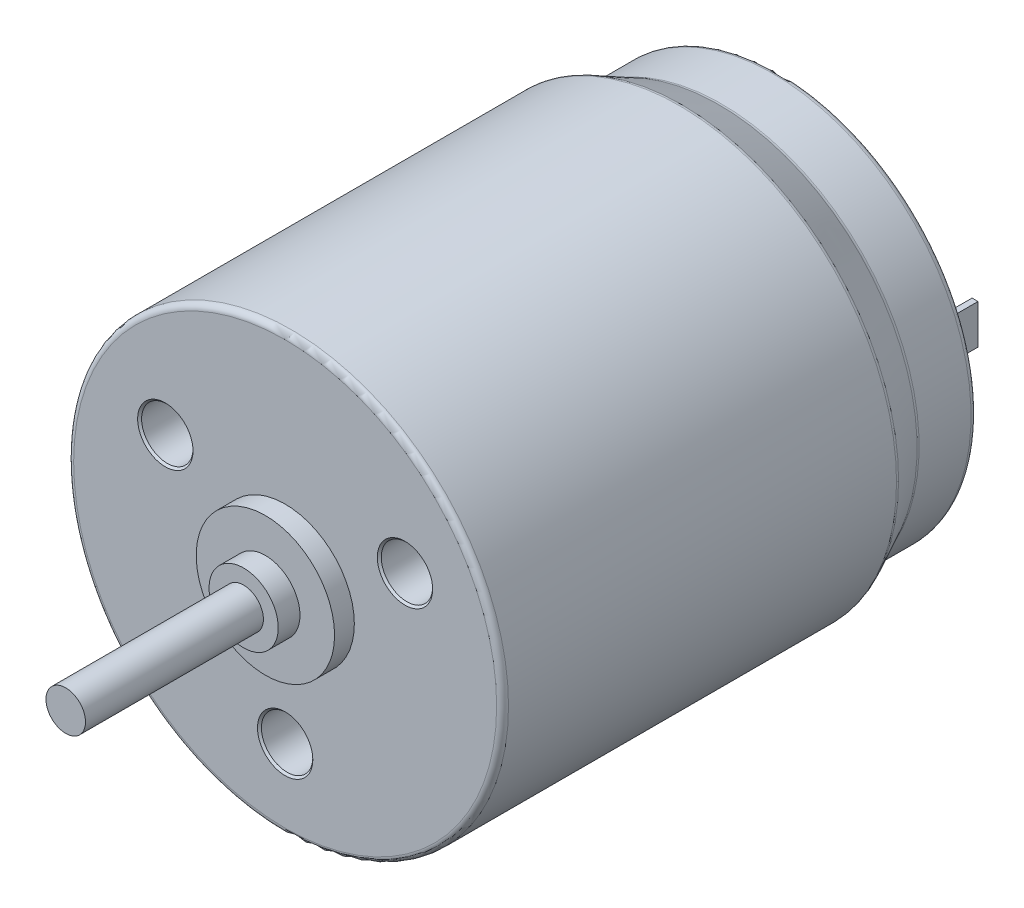
ISO-10303-21;
HEADER;
FILE_DESCRIPTION(('STEP AP214'),'2;1');
FILE_NAME('part.step','',(''),(''),'','','');
FILE_SCHEMA(('AUTOMOTIVE_DESIGN { 1 0 10303 214 1 1 1 1 }'));
ENDSEC;
DATA;
#1=APPLICATION_CONTEXT('core data for automotive mechanical design processes');
#2=APPLICATION_PROTOCOL_DEFINITION('international standard','automotive_design',2000,#1);
#3=PRODUCT_CONTEXT('',#1,'mechanical');
#4=PRODUCT('Part','Part','',(#3));
#5=PRODUCT_RELATED_PRODUCT_CATEGORY('part','',(#4));
#6=PRODUCT_DEFINITION_FORMATION('','',#4);
#7=PRODUCT_DEFINITION_CONTEXT('part definition',#1,'design');
#8=PRODUCT_DEFINITION('design','',#6,#7);
#9=PRODUCT_DEFINITION_SHAPE('','',#8);
#10=(LENGTH_UNIT() NAMED_UNIT(*) SI_UNIT(.MILLI.,.METRE.));
#11=(NAMED_UNIT(*) PLANE_ANGLE_UNIT() SI_UNIT($,.RADIAN.));
#12=(NAMED_UNIT(*) SI_UNIT($,.STERADIAN.) SOLID_ANGLE_UNIT());
#13=UNCERTAINTY_MEASURE_WITH_UNIT(LENGTH_MEASURE(1.E-05),#10,'distance_accuracy_value','');
#14=(GEOMETRIC_REPRESENTATION_CONTEXT(3) GLOBAL_UNCERTAINTY_ASSIGNED_CONTEXT((#13)) GLOBAL_UNIT_ASSIGNED_CONTEXT((#10,
#11,#12)) REPRESENTATION_CONTEXT('',''));
#15=CARTESIAN_POINT('',(0.,0.,0.));
#16=DIRECTION('',(0.,0.,1.));
#17=DIRECTION('',(1.,0.,0.));
#18=AXIS2_PLACEMENT_3D('',#15,#16,#17);
#19=CARTESIAN_POINT('',(0.,0.,-25.));
#20=DIRECTION('',(0.,0.,-1.));
#21=DIRECTION('',(-1.,0.,0.));
#22=AXIS2_PLACEMENT_3D('',#19,#20,#21);
#23=PLANE('',#22);
#24=CARTESIAN_POINT('',(0.,0.,-25.));
#25=DIRECTION('',(0.,0.,-1.));
#26=DIRECTION('',(-1.,0.,0.));
#27=AXIS2_PLACEMENT_3D('',#24,#25,#26);
#28=CIRCLE('',#27,9.7);
#29=CARTESIAN_POINT('',(-9.7,0.,-25.));
#30=VERTEX_POINT('',#29);
#31=EDGE_CURVE('E168',#30,#30,#28,.T.);
#32=ORIENTED_EDGE('',*,*,#31,.T.);
#33=EDGE_LOOP('',(#32));
#34=FACE_BOUND('',#33,.T.);
#35=DIRECTION('',(1.,0.,0.));
#36=VECTOR('',#35,1.);
#37=CARTESIAN_POINT('',(6.15,1.,-25.));
#38=LINE('',#37,#36);
#39=CARTESIAN_POINT('',(5.85,1.,-25.));
#40=VERTEX_POINT('',#39);
#41=CARTESIAN_POINT('',(6.15,1.,-25.));
#42=VERTEX_POINT('',#41);
#43=EDGE_CURVE('E133',#40,#42,#38,.T.);
#44=ORIENTED_EDGE('',*,*,#43,.F.);
#45=DIRECTION('',(0.,1.,0.));
#46=VECTOR('',#45,1.);
#47=CARTESIAN_POINT('',(5.85,1.,-25.));
#48=LINE('',#47,#46);
#49=CARTESIAN_POINT('',(5.85,-1.,-25.));
#50=VERTEX_POINT('',#49);
#51=EDGE_CURVE('E130',#50,#40,#48,.T.);
#52=ORIENTED_EDGE('',*,*,#51,.F.);
#53=DIRECTION('',(-1.,0.,0.));
#54=VECTOR('',#53,1.);
#55=CARTESIAN_POINT('',(6.15,-1.,-25.));
#56=LINE('',#55,#54);
#57=CARTESIAN_POINT('',(6.15,-1.,-25.));
#58=VERTEX_POINT('',#57);
#59=EDGE_CURVE('E142',#58,#50,#56,.T.);
#60=ORIENTED_EDGE('',*,*,#59,.F.);
#61=DIRECTION('',(0.,-1.,0.));
#62=VECTOR('',#61,1.);
#63=CARTESIAN_POINT('',(6.15,1.,-25.));
#64=LINE('',#63,#62);
#65=EDGE_CURVE('E150',#42,#58,#64,.T.);
#66=ORIENTED_EDGE('',*,*,#65,.F.);
#67=EDGE_LOOP('',(#44,#52,#60,#66));
#68=FACE_BOUND('',#67,.T.);
#69=DIRECTION('',(1.,0.,0.));
#70=VECTOR('',#69,1.);
#71=CARTESIAN_POINT('',(-5.85,1.,-25.));
#72=LINE('',#71,#70);
#73=CARTESIAN_POINT('',(-6.15,1.,-25.));
#74=VERTEX_POINT('',#73);
#75=CARTESIAN_POINT('',(-5.85,1.,-25.));
#76=VERTEX_POINT('',#75);
#77=EDGE_CURVE('E596',#74,#76,#72,.T.);
#78=ORIENTED_EDGE('',*,*,#77,.F.);
#79=DIRECTION('',(0.,1.,0.));
#80=VECTOR('',#79,1.);
#81=CARTESIAN_POINT('',(-6.15,1.,-25.));
#82=LINE('',#81,#80);
#83=CARTESIAN_POINT('',(-6.15,-1.,-25.));
#84=VERTEX_POINT('',#83);
#85=EDGE_CURVE('E128',#84,#74,#82,.T.);
#86=ORIENTED_EDGE('',*,*,#85,.F.);
#87=DIRECTION('',(-1.,0.,0.));
#88=VECTOR('',#87,1.);
#89=CARTESIAN_POINT('',(-5.85,-1.,-25.));
#90=LINE('',#89,#88);
#91=CARTESIAN_POINT('',(-5.85,-1.,-25.));
#92=VERTEX_POINT('',#91);
#93=EDGE_CURVE('E124',#92,#84,#90,.T.);
#94=ORIENTED_EDGE('',*,*,#93,.F.);
#95=DIRECTION('',(0.,-1.,0.));
#96=VECTOR('',#95,1.);
#97=CARTESIAN_POINT('',(-5.85,1.,-25.));
#98=LINE('',#97,#96);
#99=EDGE_CURVE('E593',#76,#92,#98,.T.);
#100=ORIENTED_EDGE('',*,*,#99,.F.);
#101=EDGE_LOOP('',(#78,#86,#94,#100));
#102=FACE_BOUND('',#101,.T.);
#103=ADVANCED_FACE('F39',(#34,#68,#102),#23,.T.);
#104=CARTESIAN_POINT('',(0.,0.,-20.));
#105=DIRECTION('',(0.,0.,1.));
#106=DIRECTION('',(1.,0.,0.));
#107=AXIS2_PLACEMENT_3D('',#104,#105,#106);
#108=CYLINDRICAL_SURFACE('',#107,11.);
#109=CARTESIAN_POINT('',(0.,0.,-19.9291796067501));
#110=DIRECTION('',(0.,0.,1.));
#111=DIRECTION('',(1.,0.,0.));
#112=AXIS2_PLACEMENT_3D('',#109,#110,#111);
#113=CIRCLE('',#112,11.);
#114=CARTESIAN_POINT('',(11.,0.,-19.9291796067501));
#115=VERTEX_POINT('',#114);
#116=EDGE_CURVE('E47',#115,#115,#113,.T.);
#117=ORIENTED_EDGE('',*,*,#116,.T.);
#118=EDGE_LOOP('',(#117));
#119=FACE_BOUND('',#118,.T.);
#120=CARTESIAN_POINT('',(0.,0.,-0.300000000000002));
#121=DIRECTION('',(0.,0.,1.));
#122=DIRECTION('',(1.,0.,0.));
#123=AXIS2_PLACEMENT_3D('',#120,#121,#122);
#124=CIRCLE('',#123,11.);
#125=CARTESIAN_POINT('',(11.,0.,-0.300000000000002));
#126=VERTEX_POINT('',#125);
#127=EDGE_CURVE('E221',#126,#126,#124,.F.);
#128=ORIENTED_EDGE('',*,*,#127,.T.);
#129=EDGE_LOOP('',(#128));
#130=FACE_BOUND('',#129,.T.);
#131=ADVANCED_FACE('F226',(#119,#130),#108,.T.);
#132=CARTESIAN_POINT('',(0.,0.,0.));
#133=DIRECTION('',(0.,0.,1.));
#134=DIRECTION('',(1.,0.,0.));
#135=AXIS2_PLACEMENT_3D('',#132,#133,#134);
#136=PLANE('',#135);
#137=CARTESIAN_POINT('',(0.,0.,0.));
#138=DIRECTION('',(0.,0.,1.));
#139=DIRECTION('',(1.,0.,0.));
#140=AXIS2_PLACEMENT_3D('',#137,#138,#139);
#141=CIRCLE('',#140,10.7);
#142=CARTESIAN_POINT('',(10.7,0.,0.));
#143=VERTEX_POINT('',#142);
#144=EDGE_CURVE('E12',#143,#143,#141,.T.);
#145=ORIENTED_EDGE('',*,*,#144,.T.);
#146=EDGE_LOOP('',(#145));
#147=FACE_BOUND('',#146,.T.);
#148=CARTESIAN_POINT('',(0.,0.,0.));
#149=DIRECTION('',(0.,0.,1.));
#150=DIRECTION('',(1.,0.,0.));
#151=AXIS2_PLACEMENT_3D('',#148,#149,#150);
#152=CIRCLE('',#151,3.5);
#153=CARTESIAN_POINT('',(3.5,0.,0.));
#154=VERTEX_POINT('',#153);
#155=EDGE_CURVE('E172',#154,#154,#152,.T.);
#156=ORIENTED_EDGE('',*,*,#155,.F.);
#157=EDGE_LOOP('',(#156));
#158=FACE_BOUND('',#157,.T.);
#159=CARTESIAN_POINT('',(0.,-7.,0.));
#160=DIRECTION('',(0.,0.,1.));
#161=DIRECTION('',(1.,0.,0.));
#162=AXIS2_PLACEMENT_3D('',#159,#160,#161);
#163=CIRCLE('',#162,1.4);
#164=CARTESIAN_POINT('',(1.4,-7.,0.));
#165=VERTEX_POINT('',#164);
#166=EDGE_CURVE('E199',#165,#165,#163,.F.);
#167=ORIENTED_EDGE('',*,*,#166,.T.);
#168=EDGE_LOOP('',(#167));
#169=FACE_BOUND('',#168,.T.);
#170=CARTESIAN_POINT('',(6.06217782649108,3.49999999999998,0.));
#171=DIRECTION('',(0.,0.,1.));
#172=DIRECTION('',(1.,0.,0.));
#173=AXIS2_PLACEMENT_3D('',#170,#171,#172);
#174=CIRCLE('',#173,1.40000000000001);
#175=CARTESIAN_POINT('',(7.46217782649109,3.49999999999998,0.));
#176=VERTEX_POINT('',#175);
#177=EDGE_CURVE('E196',#176,#176,#174,.F.);
#178=ORIENTED_EDGE('',*,*,#177,.T.);
#179=EDGE_LOOP('',(#178));
#180=FACE_BOUND('',#179,.T.);
#181=CARTESIAN_POINT('',(-6.06217782649108,3.49999999999998,0.));
#182=DIRECTION('',(0.,0.,1.));
#183=DIRECTION('',(1.,0.,0.));
#184=AXIS2_PLACEMENT_3D('',#181,#182,#183);
#185=CIRCLE('',#184,1.40000000000001);
#186=CARTESIAN_POINT('',(-4.66217782649108,3.49999999999998,0.));
#187=VERTEX_POINT('',#186);
#188=EDGE_CURVE('E193',#187,#187,#185,.F.);
#189=ORIENTED_EDGE('',*,*,#188,.T.);
#190=EDGE_LOOP('',(#189));
#191=FACE_BOUND('',#190,.T.);
#192=ADVANCED_FACE('F238',(#147,#158,#169,#180,#191),#136,.T.);
#193=CARTESIAN_POINT('',(0.,0.,-22.));
#194=DIRECTION('',(0.,0.,1.));
#195=DIRECTION('',(1.,0.,0.));
#196=AXIS2_PLACEMENT_3D('',#193,#194,#195);
#197=CONICAL_SURFACE('',#196,10.,0.463647609000806);
#198=CARTESIAN_POINT('',(0.,0.,-21.9366563146));
#199=DIRECTION('',(0.,0.,-1.));
#200=DIRECTION('',(-1.,0.,0.));
#201=AXIS2_PLACEMENT_3D('',#198,#199,#200);
#202=CIRCLE('',#201,10.0316718427);
#203=CARTESIAN_POINT('',(-10.0316718427,0.,-21.9366563146));
#204=VERTEX_POINT('',#203);
#205=EDGE_CURVE('E218',#204,#204,#202,.F.);
#206=ORIENTED_EDGE('',*,*,#205,.T.);
#207=EDGE_LOOP('',(#206));
#208=FACE_BOUND('',#207,.T.);
#209=CARTESIAN_POINT('',(0.,0.,-20.0633436854));
#210=DIRECTION('',(0.,0.,-1.));
#211=DIRECTION('',(-1.,0.,0.));
#212=AXIS2_PLACEMENT_3D('',#209,#210,#211);
#213=CIRCLE('',#212,10.9683281573);
#214=CARTESIAN_POINT('',(-10.9683281573,0.,-20.0633436854));
#215=VERTEX_POINT('',#214);
#216=EDGE_CURVE('E215',#215,#215,#213,.T.);
#217=ORIENTED_EDGE('',*,*,#216,.T.);
#218=EDGE_LOOP('',(#217));
#219=FACE_BOUND('',#218,.T.);
#220=ADVANCED_FACE('F235',(#208,#219),#197,.T.);
#221=CARTESIAN_POINT('',(0.,0.,-25.));
#222=DIRECTION('',(0.,0.,1.));
#223=DIRECTION('',(1.,0.,0.));
#224=AXIS2_PLACEMENT_3D('',#221,#222,#223);
#225=CYLINDRICAL_SURFACE('',#224,10.);
#226=CARTESIAN_POINT('',(0.,0.,-24.7));
#227=DIRECTION('',(0.,0.,-1.));
#228=DIRECTION('',(-1.,0.,0.));
#229=AXIS2_PLACEMENT_3D('',#226,#227,#228);
#230=CIRCLE('',#229,10.);
#231=CARTESIAN_POINT('',(-10.,0.,-24.7));
#232=VERTEX_POINT('',#231);
#233=EDGE_CURVE('E212',#232,#232,#230,.F.);
#234=ORIENTED_EDGE('',*,*,#233,.T.);
#235=EDGE_LOOP('',(#234));
#236=FACE_BOUND('',#235,.T.);
#237=CARTESIAN_POINT('',(0.,0.,-22.0708203932499));
#238=DIRECTION('',(0.,0.,-1.));
#239=DIRECTION('',(-1.,0.,0.));
#240=AXIS2_PLACEMENT_3D('',#237,#238,#239);
#241=CIRCLE('',#240,10.);
#242=CARTESIAN_POINT('',(-10.,0.,-22.0708203932499));
#243=VERTEX_POINT('',#242);
#244=EDGE_CURVE('E209',#243,#243,#241,.T.);
#245=ORIENTED_EDGE('',*,*,#244,.T.);
#246=EDGE_LOOP('',(#245));
#247=FACE_BOUND('',#246,.T.);
#248=ADVANCED_FACE('F237',(#236,#247),#225,.T.);
#249=CARTESIAN_POINT('',(0.,-7.,-5.));
#250=DIRECTION('',(0.,0.,1.));
#251=DIRECTION('',(1.,0.,0.));
#252=AXIS2_PLACEMENT_3D('',#249,#250,#251);
#253=CYLINDRICAL_SURFACE('',#252,1.3);
#254=CARTESIAN_POINT('',(0.,-7.,-0.100000000000002));
#255=DIRECTION('',(0.,0.,1.));
#256=DIRECTION('',(1.,0.,0.));
#257=AXIS2_PLACEMENT_3D('',#254,#255,#256);
#258=CIRCLE('',#257,1.3);
#259=CARTESIAN_POINT('',(1.3,-7.,-0.100000000000002));
#260=VERTEX_POINT('',#259);
#261=EDGE_CURVE('E185',#260,#260,#258,.T.);
#262=ORIENTED_EDGE('',*,*,#261,.T.);
#263=EDGE_LOOP('',(#262));
#264=FACE_BOUND('',#263,.T.);
#265=CARTESIAN_POINT('',(0.,-7.,-5.));
#266=DIRECTION('',(0.,0.,1.));
#267=DIRECTION('',(1.,0.,0.));
#268=AXIS2_PLACEMENT_3D('',#265,#266,#267);
#269=CIRCLE('',#268,1.3);
#270=CARTESIAN_POINT('',(1.3,-7.,-5.));
#271=VERTEX_POINT('',#270);
#272=EDGE_CURVE('E179',#271,#271,#269,.T.);
#273=ORIENTED_EDGE('',*,*,#272,.F.);
#274=EDGE_LOOP('',(#273));
#275=FACE_BOUND('',#274,.T.);
#276=ADVANCED_FACE('F245',(#264,#275),#253,.F.);
#277=CARTESIAN_POINT('',(0.,-7.,-5.));
#278=DIRECTION('',(0.,0.,1.));
#279=DIRECTION('',(1.,0.,0.));
#280=AXIS2_PLACEMENT_3D('',#277,#278,#279);
#281=PLANE('',#280);
#282=ORIENTED_EDGE('',*,*,#272,.T.);
#283=EDGE_LOOP('',(#282));
#284=FACE_BOUND('',#283,.T.);
#285=ADVANCED_FACE('F261',(#284),#281,.T.);
#286=CARTESIAN_POINT('',(6.06217782649108,3.49999999999998,-5.));
#287=DIRECTION('',(0.,0.,1.));
#288=DIRECTION('',(1.,0.,0.));
#289=AXIS2_PLACEMENT_3D('',#286,#287,#288);
#290=CYLINDRICAL_SURFACE('',#289,1.3);
#291=CARTESIAN_POINT('',(6.06217782649108,3.49999999999998,-0.100000000000007));
#292=DIRECTION('',(0.,0.,1.));
#293=DIRECTION('',(1.,0.,0.));
#294=AXIS2_PLACEMENT_3D('',#291,#292,#293);
#295=CIRCLE('',#294,1.3);
#296=CARTESIAN_POINT('',(7.36217782649108,3.49999999999998,-0.100000000000007));
#297=VERTEX_POINT('',#296);
#298=EDGE_CURVE('E202',#297,#297,#295,.T.);
#299=ORIENTED_EDGE('',*,*,#298,.T.);
#300=EDGE_LOOP('',(#299));
#301=FACE_BOUND('',#300,.T.);
#302=CARTESIAN_POINT('',(6.06217782649108,3.49999999999998,-5.));
#303=DIRECTION('',(0.,0.,1.));
#304=DIRECTION('',(1.,0.,0.));
#305=AXIS2_PLACEMENT_3D('',#302,#303,#304);
#306=CIRCLE('',#305,1.3);
#307=CARTESIAN_POINT('',(7.36217782649108,3.49999999999998,-5.));
#308=VERTEX_POINT('',#307);
#309=EDGE_CURVE('E186',#308,#308,#306,.T.);
#310=ORIENTED_EDGE('',*,*,#309,.F.);
#311=EDGE_LOOP('',(#310));
#312=FACE_BOUND('',#311,.T.);
#313=ADVANCED_FACE('F265',(#301,#312),#290,.F.);
#314=CARTESIAN_POINT('',(6.06217782649108,3.49999999999998,-5.));
#315=DIRECTION('',(0.,0.,1.));
#316=DIRECTION('',(1.,0.,0.));
#317=AXIS2_PLACEMENT_3D('',#314,#315,#316);
#318=PLANE('',#317);
#319=ORIENTED_EDGE('',*,*,#309,.T.);
#320=EDGE_LOOP('',(#319));
#321=FACE_BOUND('',#320,.T.);
#322=ADVANCED_FACE('F269',(#321),#318,.T.);
#323=CARTESIAN_POINT('',(-6.06217782649108,3.49999999999998,-5.));
#324=DIRECTION('',(0.,0.,1.));
#325=DIRECTION('',(1.,0.,0.));
#326=AXIS2_PLACEMENT_3D('',#323,#324,#325);
#327=CYLINDRICAL_SURFACE('',#326,1.3);
#328=CARTESIAN_POINT('',(-6.06217782649108,3.49999999999998,-0.100000000000007));
#329=DIRECTION('',(0.,0.,1.));
#330=DIRECTION('',(1.,0.,0.));
#331=AXIS2_PLACEMENT_3D('',#328,#329,#330);
#332=CIRCLE('',#331,1.3);
#333=CARTESIAN_POINT('',(-4.76217782649108,3.49999999999998,-0.100000000000007));
#334=VERTEX_POINT('',#333);
#335=EDGE_CURVE('E175',#334,#334,#332,.T.);
#336=ORIENTED_EDGE('',*,*,#335,.T.);
#337=EDGE_LOOP('',(#336));
#338=FACE_BOUND('',#337,.T.);
#339=CARTESIAN_POINT('',(-6.06217782649108,3.49999999999998,-5.));
#340=DIRECTION('',(0.,0.,1.));
#341=DIRECTION('',(1.,0.,0.));
#342=AXIS2_PLACEMENT_3D('',#339,#340,#341);
#343=CIRCLE('',#342,1.3);
#344=CARTESIAN_POINT('',(-4.76217782649108,3.49999999999998,-5.));
#345=VERTEX_POINT('',#344);
#346=EDGE_CURVE('E182',#345,#345,#343,.T.);
#347=ORIENTED_EDGE('',*,*,#346,.F.);
#348=EDGE_LOOP('',(#347));
#349=FACE_BOUND('',#348,.T.);
#350=ADVANCED_FACE('F273',(#338,#349),#327,.F.);
#351=CARTESIAN_POINT('',(-6.06217782649108,3.49999999999998,-5.));
#352=DIRECTION('',(0.,0.,1.));
#353=DIRECTION('',(1.,0.,0.));
#354=AXIS2_PLACEMENT_3D('',#351,#352,#353);
#355=PLANE('',#354);
#356=ORIENTED_EDGE('',*,*,#346,.T.);
#357=EDGE_LOOP('',(#356));
#358=FACE_BOUND('',#357,.T.);
#359=ADVANCED_FACE('F277',(#358),#355,.T.);
#360=CARTESIAN_POINT('',(0.,-7.,-0.100000000000002));
#361=DIRECTION('',(0.,0.,1.));
#362=DIRECTION('',(1.,0.,0.));
#363=AXIS2_PLACEMENT_3D('',#360,#361,#362);
#364=CONICAL_SURFACE('',#363,1.3,0.785398163397448);
#365=ORIENTED_EDGE('',*,*,#166,.F.);
#366=EDGE_LOOP('',(#365));
#367=FACE_BOUND('',#366,.T.);
#368=ORIENTED_EDGE('',*,*,#261,.F.);
#369=EDGE_LOOP('',(#368));
#370=FACE_BOUND('',#369,.T.);
#371=ADVANCED_FACE('F281',(#367,#370),#364,.F.);
#372=CARTESIAN_POINT('',(6.06217782649108,3.49999999999998,-0.100000000000007));
#373=DIRECTION('',(0.,0.,1.));
#374=DIRECTION('',(1.,0.,0.));
#375=AXIS2_PLACEMENT_3D('',#372,#373,#374);
#376=CONICAL_SURFACE('',#375,1.3,0.785398163397441);
#377=ORIENTED_EDGE('',*,*,#177,.F.);
#378=EDGE_LOOP('',(#377));
#379=FACE_BOUND('',#378,.T.);
#380=ORIENTED_EDGE('',*,*,#298,.F.);
#381=EDGE_LOOP('',(#380));
#382=FACE_BOUND('',#381,.T.);
#383=ADVANCED_FACE('F355',(#379,#382),#376,.F.);
#384=CARTESIAN_POINT('',(-6.06217782649108,3.49999999999998,-0.100000000000007));
#385=DIRECTION('',(0.,0.,1.));
#386=DIRECTION('',(1.,0.,0.));
#387=AXIS2_PLACEMENT_3D('',#384,#385,#386);
#388=CONICAL_SURFACE('',#387,1.3,0.785398163397441);
#389=ORIENTED_EDGE('',*,*,#188,.F.);
#390=EDGE_LOOP('',(#389));
#391=FACE_BOUND('',#390,.T.);
#392=ORIENTED_EDGE('',*,*,#335,.F.);
#393=EDGE_LOOP('',(#392));
#394=FACE_BOUND('',#393,.T.);
#395=ADVANCED_FACE('F287',(#391,#394),#388,.F.);
#396=CARTESIAN_POINT('',(0.,0.,1.));
#397=DIRECTION('',(0.,0.,-1.));
#398=DIRECTION('',(-1.,0.,0.));
#399=AXIS2_PLACEMENT_3D('',#396,#397,#398);
#400=CYLINDRICAL_SURFACE('',#399,3.5);
#401=CARTESIAN_POINT('',(0.,0.,1.));
#402=DIRECTION('',(0.,0.,1.));
#403=DIRECTION('',(1.,0.,0.));
#404=AXIS2_PLACEMENT_3D('',#401,#402,#403);
#405=CIRCLE('',#404,3.5);
#406=CARTESIAN_POINT('',(3.5,0.,1.));
#407=VERTEX_POINT('',#406);
#408=EDGE_CURVE('E176',#407,#407,#405,.T.);
#409=ORIENTED_EDGE('',*,*,#408,.F.);
#410=EDGE_LOOP('',(#409));
#411=FACE_BOUND('',#410,.T.);
#412=ORIENTED_EDGE('',*,*,#155,.T.);
#413=EDGE_LOOP('',(#412));
#414=FACE_BOUND('',#413,.T.);
#415=ADVANCED_FACE('F283',(#411,#414),#400,.T.);
#416=CARTESIAN_POINT('',(0.,0.,1.));
#417=DIRECTION('',(0.,0.,1.));
#418=DIRECTION('',(1.,0.,0.));
#419=AXIS2_PLACEMENT_3D('',#416,#417,#418);
#420=PLANE('',#419);
#421=CARTESIAN_POINT('',(0.,0.,1.));
#422=DIRECTION('',(0.,0.,1.));
#423=DIRECTION('',(1.,0.,0.));
#424=AXIS2_PLACEMENT_3D('',#421,#422,#423);
#425=CIRCLE('',#424,1.75);
#426=CARTESIAN_POINT('',(1.75,0.,1.));
#427=VERTEX_POINT('',#426);
#428=EDGE_CURVE('E169',#427,#427,#425,.T.);
#429=ORIENTED_EDGE('',*,*,#428,.F.);
#430=EDGE_LOOP('',(#429));
#431=FACE_BOUND('',#430,.T.);
#432=ORIENTED_EDGE('',*,*,#408,.T.);
#433=EDGE_LOOP('',(#432));
#434=FACE_BOUND('',#433,.T.);
#435=ADVANCED_FACE('F286',(#431,#434),#420,.T.);
#436=CARTESIAN_POINT('',(0.,0.,2.1));
#437=DIRECTION('',(0.,0.,-1.));
#438=DIRECTION('',(-1.,0.,0.));
#439=AXIS2_PLACEMENT_3D('',#436,#437,#438);
#440=CYLINDRICAL_SURFACE('',#439,1.75);
#441=CARTESIAN_POINT('',(0.,0.,2.1));
#442=DIRECTION('',(0.,0.,1.));
#443=DIRECTION('',(1.,0.,0.));
#444=AXIS2_PLACEMENT_3D('',#441,#442,#443);
#445=CIRCLE('',#444,1.75);
#446=CARTESIAN_POINT('',(1.75,0.,2.1));
#447=VERTEX_POINT('',#446);
#448=EDGE_CURVE('E164',#447,#447,#445,.T.);
#449=ORIENTED_EDGE('',*,*,#448,.F.);
#450=EDGE_LOOP('',(#449));
#451=FACE_BOUND('',#450,.T.);
#452=ORIENTED_EDGE('',*,*,#428,.T.);
#453=EDGE_LOOP('',(#452));
#454=FACE_BOUND('',#453,.T.);
#455=ADVANCED_FACE('F291',(#451,#454),#440,.T.);
#456=CARTESIAN_POINT('',(0.,0.,2.1));
#457=DIRECTION('',(0.,0.,1.));
#458=DIRECTION('',(1.,0.,0.));
#459=AXIS2_PLACEMENT_3D('',#456,#457,#458);
#460=PLANE('',#459);
#461=CARTESIAN_POINT('',(0.,0.,2.1));
#462=DIRECTION('',(0.,0.,1.));
#463=DIRECTION('',(1.,0.,0.));
#464=AXIS2_PLACEMENT_3D('',#461,#462,#463);
#465=CIRCLE('',#464,1.);
#466=CARTESIAN_POINT('',(1.,0.,2.1));
#467=VERTEX_POINT('',#466);
#468=EDGE_CURVE('E165',#467,#467,#465,.T.);
#469=ORIENTED_EDGE('',*,*,#468,.F.);
#470=EDGE_LOOP('',(#469));
#471=FACE_BOUND('',#470,.T.);
#472=ORIENTED_EDGE('',*,*,#448,.T.);
#473=EDGE_LOOP('',(#472));
#474=FACE_BOUND('',#473,.T.);
#475=ADVANCED_FACE('F295',(#471,#474),#460,.T.);
#476=CARTESIAN_POINT('',(0.,0.,11.1));
#477=DIRECTION('',(0.,0.,-1.));
#478=DIRECTION('',(-1.,0.,0.));
#479=AXIS2_PLACEMENT_3D('',#476,#477,#478);
#480=CYLINDRICAL_SURFACE('',#479,1.);
#481=CARTESIAN_POINT('',(0.,0.,11.1));
#482=DIRECTION('',(0.,0.,1.));
#483=DIRECTION('',(1.,0.,0.));
#484=AXIS2_PLACEMENT_3D('',#481,#482,#483);
#485=CIRCLE('',#484,1.);
#486=CARTESIAN_POINT('',(1.,0.,11.1));
#487=VERTEX_POINT('',#486);
#488=EDGE_CURVE('E161',#487,#487,#485,.T.);
#489=ORIENTED_EDGE('',*,*,#488,.F.);
#490=EDGE_LOOP('',(#489));
#491=FACE_BOUND('',#490,.T.);
#492=ORIENTED_EDGE('',*,*,#468,.T.);
#493=EDGE_LOOP('',(#492));
#494=FACE_BOUND('',#493,.T.);
#495=ADVANCED_FACE('F299',(#491,#494),#480,.T.);
#496=CARTESIAN_POINT('',(0.,0.,11.1));
#497=DIRECTION('',(0.,0.,1.));
#498=DIRECTION('',(1.,0.,0.));
#499=AXIS2_PLACEMENT_3D('',#496,#497,#498);
#500=PLANE('',#499);
#501=ORIENTED_EDGE('',*,*,#488,.T.);
#502=EDGE_LOOP('',(#501));
#503=FACE_BOUND('',#502,.T.);
#504=ADVANCED_FACE('F303',(#503),#500,.T.);
#505=CARTESIAN_POINT('',(5.85,1.,-28.9));
#506=DIRECTION('',(1.,0.,0.));
#507=DIRECTION('',(0.,0.,-1.));
#508=AXIS2_PLACEMENT_3D('',#505,#506,#507);
#509=PLANE('',#508);
#510=ORIENTED_EDGE('',*,*,#51,.T.);
#511=DIRECTION('',(0.,0.,1.));
#512=VECTOR('',#511,1.);
#513=CARTESIAN_POINT('',(5.85,1.,-28.9));
#514=LINE('',#513,#512);
#515=CARTESIAN_POINT('',(5.85,1.,-28.9));
#516=VERTEX_POINT('',#515);
#517=EDGE_CURVE('E159',#516,#40,#514,.T.);
#518=ORIENTED_EDGE('',*,*,#517,.F.);
#519=DIRECTION('',(0.,1.,0.));
#520=VECTOR('',#519,1.);
#521=CARTESIAN_POINT('',(5.85,1.,-28.9));
#522=LINE('',#521,#520);
#523=CARTESIAN_POINT('',(5.85,-1.,-28.9));
#524=VERTEX_POINT('',#523);
#525=EDGE_CURVE('E138',#524,#516,#522,.T.);
#526=ORIENTED_EDGE('',*,*,#525,.F.);
#527=DIRECTION('',(0.,0.,1.));
#528=VECTOR('',#527,1.);
#529=CARTESIAN_POINT('',(5.85,-1.,-28.9));
#530=LINE('',#529,#528);
#531=EDGE_CURVE('E147',#524,#50,#530,.T.);
#532=ORIENTED_EDGE('',*,*,#531,.T.);
#533=EDGE_LOOP('',(#510,#518,#526,#532));
#534=FACE_BOUND('',#533,.T.);
#535=ADVANCED_FACE('F307',(#534),#509,.F.);
#536=CARTESIAN_POINT('',(6.15,1.,-28.9));
#537=DIRECTION('',(0.,-1.,0.));
#538=DIRECTION('',(0.,0.,-1.));
#539=AXIS2_PLACEMENT_3D('',#536,#537,#538);
#540=PLANE('',#539);
#541=ORIENTED_EDGE('',*,*,#43,.T.);
#542=DIRECTION('',(0.,0.,1.));
#543=VECTOR('',#542,1.);
#544=CARTESIAN_POINT('',(6.15,1.,-28.9));
#545=LINE('',#544,#543);
#546=CARTESIAN_POINT('',(6.15,1.,-28.9));
#547=VERTEX_POINT('',#546);
#548=EDGE_CURVE('E156',#547,#42,#545,.T.);
#549=ORIENTED_EDGE('',*,*,#548,.F.);
#550=DIRECTION('',(1.,0.,0.));
#551=VECTOR('',#550,1.);
#552=CARTESIAN_POINT('',(6.15,1.,-28.9));
#553=LINE('',#552,#551);
#554=EDGE_CURVE('E141',#516,#547,#553,.T.);
#555=ORIENTED_EDGE('',*,*,#554,.F.);
#556=ORIENTED_EDGE('',*,*,#517,.T.);
#557=EDGE_LOOP('',(#541,#549,#555,#556));
#558=FACE_BOUND('',#557,.T.);
#559=ADVANCED_FACE('F311',(#558),#540,.F.);
#560=CARTESIAN_POINT('',(6.15,1.,-28.9));
#561=DIRECTION('',(-1.,0.,0.));
#562=DIRECTION('',(0.,0.,1.));
#563=AXIS2_PLACEMENT_3D('',#560,#561,#562);
#564=PLANE('',#563);
#565=ORIENTED_EDGE('',*,*,#65,.T.);
#566=DIRECTION('',(0.,0.,1.));
#567=VECTOR('',#566,1.);
#568=CARTESIAN_POINT('',(6.15,-1.,-28.9));
#569=LINE('',#568,#567);
#570=CARTESIAN_POINT('',(6.15,-1.,-28.9));
#571=VERTEX_POINT('',#570);
#572=EDGE_CURVE('E62',#571,#58,#569,.T.);
#573=ORIENTED_EDGE('',*,*,#572,.F.);
#574=DIRECTION('',(0.,-1.,0.));
#575=VECTOR('',#574,1.);
#576=CARTESIAN_POINT('',(6.15,1.,-28.9));
#577=LINE('',#576,#575);
#578=EDGE_CURVE('E144',#547,#571,#577,.T.);
#579=ORIENTED_EDGE('',*,*,#578,.F.);
#580=ORIENTED_EDGE('',*,*,#548,.T.);
#581=EDGE_LOOP('',(#565,#573,#579,#580));
#582=FACE_BOUND('',#581,.T.);
#583=ADVANCED_FACE('F315',(#582),#564,.F.);
#584=CARTESIAN_POINT('',(6.15,-1.,-28.9));
#585=DIRECTION('',(0.,1.,0.));
#586=DIRECTION('',(0.,0.,1.));
#587=AXIS2_PLACEMENT_3D('',#584,#585,#586);
#588=PLANE('',#587);
#589=ORIENTED_EDGE('',*,*,#59,.T.);
#590=ORIENTED_EDGE('',*,*,#531,.F.);
#591=DIRECTION('',(-1.,0.,0.));
#592=VECTOR('',#591,1.);
#593=CARTESIAN_POINT('',(6.15,-1.,-28.9));
#594=LINE('',#593,#592);
#595=EDGE_CURVE('E146',#571,#524,#594,.T.);
#596=ORIENTED_EDGE('',*,*,#595,.F.);
#597=ORIENTED_EDGE('',*,*,#572,.T.);
#598=EDGE_LOOP('',(#589,#590,#596,#597));
#599=FACE_BOUND('',#598,.T.);
#600=ADVANCED_FACE('F319',(#599),#588,.F.);
#601=CARTESIAN_POINT('',(0.,0.,-28.9));
#602=DIRECTION('',(0.,0.,-1.));
#603=DIRECTION('',(-1.,0.,0.));
#604=AXIS2_PLACEMENT_3D('',#601,#602,#603);
#605=PLANE('',#604);
#606=ORIENTED_EDGE('',*,*,#525,.T.);
#607=ORIENTED_EDGE('',*,*,#554,.T.);
#608=ORIENTED_EDGE('',*,*,#578,.T.);
#609=ORIENTED_EDGE('',*,*,#595,.T.);
#610=EDGE_LOOP('',(#606,#607,#608,#609));
#611=FACE_BOUND('',#610,.T.);
#612=ADVANCED_FACE('F323',(#611),#605,.T.);
#613=CARTESIAN_POINT('',(-6.15,1.,-28.9));
#614=DIRECTION('',(1.,0.,0.));
#615=DIRECTION('',(0.,0.,-1.));
#616=AXIS2_PLACEMENT_3D('',#613,#614,#615);
#617=PLANE('',#616);
#618=ORIENTED_EDGE('',*,*,#85,.T.);
#619=DIRECTION('',(0.,0.,1.));
#620=VECTOR('',#619,1.);
#621=CARTESIAN_POINT('',(-6.15,1.,-28.9));
#622=LINE('',#621,#620);
#623=CARTESIAN_POINT('',(-6.15,1.,-28.9));
#624=VERTEX_POINT('',#623);
#625=EDGE_CURVE('E109',#624,#74,#622,.T.);
#626=ORIENTED_EDGE('',*,*,#625,.F.);
#627=DIRECTION('',(0.,1.,0.));
#628=VECTOR('',#627,1.);
#629=CARTESIAN_POINT('',(-6.15,1.,-28.9));
#630=LINE('',#629,#628);
#631=CARTESIAN_POINT('',(-6.15,-1.,-28.9));
#632=VERTEX_POINT('',#631);
#633=EDGE_CURVE('E116',#632,#624,#630,.T.);
#634=ORIENTED_EDGE('',*,*,#633,.F.);
#635=DIRECTION('',(0.,0.,1.));
#636=VECTOR('',#635,1.);
#637=CARTESIAN_POINT('',(-6.15,-1.,-28.9));
#638=LINE('',#637,#636);
#639=EDGE_CURVE('E590',#632,#84,#638,.T.);
#640=ORIENTED_EDGE('',*,*,#639,.T.);
#641=EDGE_LOOP('',(#618,#626,#634,#640));
#642=FACE_BOUND('',#641,.T.);
#643=ADVANCED_FACE('F126',(#642),#617,.F.);
#644=CARTESIAN_POINT('',(-5.85,1.,-28.9));
#645=DIRECTION('',(0.,-1.,0.));
#646=DIRECTION('',(1.,0.,0.));
#647=AXIS2_PLACEMENT_3D('',#644,#645,#646);
#648=PLANE('',#647);
#649=ORIENTED_EDGE('',*,*,#77,.T.);
#650=DIRECTION('',(0.,0.,1.));
#651=VECTOR('',#650,1.);
#652=CARTESIAN_POINT('',(-5.85,1.,-28.9));
#653=LINE('',#652,#651);
#654=CARTESIAN_POINT('',(-5.85,1.,-28.9));
#655=VERTEX_POINT('',#654);
#656=EDGE_CURVE('E112',#655,#76,#653,.T.);
#657=ORIENTED_EDGE('',*,*,#656,.F.);
#658=DIRECTION('',(1.,0.,0.));
#659=VECTOR('',#658,1.);
#660=CARTESIAN_POINT('',(-5.85,1.,-28.9));
#661=LINE('',#660,#659);
#662=EDGE_CURVE('E105',#624,#655,#661,.T.);
#663=ORIENTED_EDGE('',*,*,#662,.F.);
#664=ORIENTED_EDGE('',*,*,#625,.T.);
#665=EDGE_LOOP('',(#649,#657,#663,#664));
#666=FACE_BOUND('',#665,.T.);
#667=ADVANCED_FACE('F107',(#666),#648,.F.);
#668=CARTESIAN_POINT('',(-5.85,1.,-28.9));
#669=DIRECTION('',(-1.,0.,0.));
#670=DIRECTION('',(0.,0.,1.));
#671=AXIS2_PLACEMENT_3D('',#668,#669,#670);
#672=PLANE('',#671);
#673=ORIENTED_EDGE('',*,*,#99,.T.);
#674=DIRECTION('',(0.,0.,1.));
#675=VECTOR('',#674,1.);
#676=CARTESIAN_POINT('',(-5.85,-1.,-28.9));
#677=LINE('',#676,#675);
#678=CARTESIAN_POINT('',(-5.85,-1.,-28.9));
#679=VERTEX_POINT('',#678);
#680=EDGE_CURVE('E54',#679,#92,#677,.T.);
#681=ORIENTED_EDGE('',*,*,#680,.F.);
#682=DIRECTION('',(0.,-1.,0.));
#683=VECTOR('',#682,1.);
#684=CARTESIAN_POINT('',(-5.85,1.,-28.9));
#685=LINE('',#684,#683);
#686=EDGE_CURVE('E115',#655,#679,#685,.T.);
#687=ORIENTED_EDGE('',*,*,#686,.F.);
#688=ORIENTED_EDGE('',*,*,#656,.T.);
#689=EDGE_LOOP('',(#673,#681,#687,#688));
#690=FACE_BOUND('',#689,.T.);
#691=ADVANCED_FACE('F331',(#690),#672,.F.);
#692=CARTESIAN_POINT('',(-5.85,-1.,-28.9));
#693=DIRECTION('',(0.,1.,0.));
#694=DIRECTION('',(0.,0.,1.));
#695=AXIS2_PLACEMENT_3D('',#692,#693,#694);
#696=PLANE('',#695);
#697=ORIENTED_EDGE('',*,*,#93,.T.);
#698=ORIENTED_EDGE('',*,*,#639,.F.);
#699=DIRECTION('',(-1.,0.,0.));
#700=VECTOR('',#699,1.);
#701=CARTESIAN_POINT('',(-5.85,-1.,-28.9));
#702=LINE('',#701,#700);
#703=EDGE_CURVE('E120',#679,#632,#702,.T.);
#704=ORIENTED_EDGE('',*,*,#703,.F.);
#705=ORIENTED_EDGE('',*,*,#680,.T.);
#706=EDGE_LOOP('',(#697,#698,#704,#705));
#707=FACE_BOUND('',#706,.T.);
#708=ADVANCED_FACE('F334',(#707),#696,.F.);
#709=CARTESIAN_POINT('',(0.,0.,-28.9));
#710=DIRECTION('',(0.,0.,-1.));
#711=DIRECTION('',(-1.,0.,0.));
#712=AXIS2_PLACEMENT_3D('',#709,#710,#711);
#713=PLANE('',#712);
#714=ORIENTED_EDGE('',*,*,#633,.T.);
#715=ORIENTED_EDGE('',*,*,#662,.T.);
#716=ORIENTED_EDGE('',*,*,#686,.T.);
#717=ORIENTED_EDGE('',*,*,#703,.T.);
#718=EDGE_LOOP('',(#714,#715,#716,#717));
#719=FACE_BOUND('',#718,.T.);
#720=ADVANCED_FACE('F119',(#719),#713,.T.);
#721=CARTESIAN_POINT('',(0.,0.,-24.7));
#722=DIRECTION('',(0.,0.,-1.));
#723=DIRECTION('',(-1.,0.,0.));
#724=AXIS2_PLACEMENT_3D('',#721,#722,#723);
#725=TOROIDAL_SURFACE('',#724,9.7,0.3);
#726=ORIENTED_EDGE('',*,*,#233,.F.);
#727=EDGE_LOOP('',(#726));
#728=FACE_BOUND('',#727,.T.);
#729=ORIENTED_EDGE('',*,*,#31,.F.);
#730=EDGE_LOOP('',(#729));
#731=FACE_BOUND('',#730,.T.);
#732=ADVANCED_FACE('F339',(#728,#731),#725,.T.);
#733=CARTESIAN_POINT('',(0.,0.,-22.0708203932499));
#734=DIRECTION('',(0.,0.,-1.));
#735=DIRECTION('',(-1.,0.,0.));
#736=AXIS2_PLACEMENT_3D('',#733,#734,#735);
#737=TOROIDAL_SURFACE('',#736,10.3,0.3);
#738=ORIENTED_EDGE('',*,*,#205,.F.);
#739=EDGE_LOOP('',(#738));
#740=FACE_BOUND('',#739,.T.);
#741=ORIENTED_EDGE('',*,*,#244,.F.);
#742=EDGE_LOOP('',(#741));
#743=FACE_BOUND('',#742,.T.);
#744=ADVANCED_FACE('F232',(#740,#743),#737,.F.);
#745=CARTESIAN_POINT('',(0.,0.,-19.9291796067501));
#746=DIRECTION('',(0.,0.,1.));
#747=DIRECTION('',(1.,0.,0.));
#748=AXIS2_PLACEMENT_3D('',#745,#746,#747);
#749=TOROIDAL_SURFACE('',#748,10.7,0.3);
#750=ORIENTED_EDGE('',*,*,#116,.F.);
#751=EDGE_LOOP('',(#750));
#752=FACE_BOUND('',#751,.T.);
#753=ORIENTED_EDGE('',*,*,#216,.F.);
#754=EDGE_LOOP('',(#753));
#755=FACE_BOUND('',#754,.T.);
#756=ADVANCED_FACE('F229',(#752,#755),#749,.T.);
#757=CARTESIAN_POINT('',(0.,0.,-0.300000000000002));
#758=DIRECTION('',(0.,0.,1.));
#759=DIRECTION('',(1.,0.,0.));
#760=AXIS2_PLACEMENT_3D('',#757,#758,#759);
#761=TOROIDAL_SURFACE('',#760,10.7,0.3);
#762=ORIENTED_EDGE('',*,*,#127,.F.);
#763=EDGE_LOOP('',(#762));
#764=FACE_BOUND('',#763,.T.);
#765=ORIENTED_EDGE('',*,*,#144,.F.);
#766=EDGE_LOOP('',(#765));
#767=FACE_BOUND('',#766,.T.);
#768=ADVANCED_FACE('F41',(#764,#767),#761,.T.);
#769=CLOSED_SHELL('',(#103,#131,#192,#220,#248,#276,#285,#313,#322,#350,#359,#371,#383,#395,
#415,#435,#455,#475,#495,#504,#535,#559,#583,#600,#612,#643,#667,#691,#708,#720,#732,#744,#756,#768));
#770=MANIFOLD_SOLID_BREP('B2',#769);
#771=ADVANCED_BREP_SHAPE_REPRESENTATION('',(#18,#770),#14);
#772=SHAPE_DEFINITION_REPRESENTATION(#9,#771);
ENDSEC;
END-ISO-10303-21;
